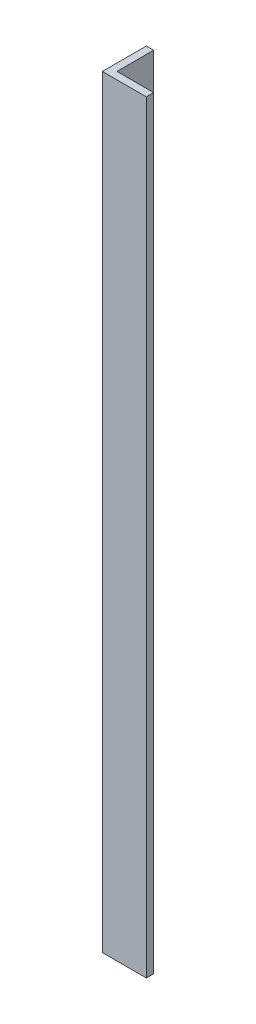
ISO-10303-21;
HEADER;
FILE_DESCRIPTION(('STEP AP214'),'2;1');
FILE_NAME('part.step','',(''),(''),'','','');
FILE_SCHEMA(('AUTOMOTIVE_DESIGN { 1 0 10303 214 1 1 1 1 }'));
ENDSEC;
DATA;
#1=APPLICATION_CONTEXT('core data for automotive mechanical design processes');
#2=APPLICATION_PROTOCOL_DEFINITION('international standard','automotive_design',2000,#1);
#3=PRODUCT_CONTEXT('',#1,'mechanical');
#4=PRODUCT('Part','Part','',(#3));
#5=PRODUCT_RELATED_PRODUCT_CATEGORY('part','',(#4));
#6=PRODUCT_DEFINITION_FORMATION('','',#4);
#7=PRODUCT_DEFINITION_CONTEXT('part definition',#1,'design');
#8=PRODUCT_DEFINITION('design','',#6,#7);
#9=PRODUCT_DEFINITION_SHAPE('','',#8);
#10=(LENGTH_UNIT() NAMED_UNIT(*) SI_UNIT(.MILLI.,.METRE.));
#11=(NAMED_UNIT(*) PLANE_ANGLE_UNIT() SI_UNIT($,.RADIAN.));
#12=(NAMED_UNIT(*) SI_UNIT($,.STERADIAN.) SOLID_ANGLE_UNIT());
#13=UNCERTAINTY_MEASURE_WITH_UNIT(LENGTH_MEASURE(1.E-05),#10,'distance_accuracy_value','');
#14=(GEOMETRIC_REPRESENTATION_CONTEXT(3) GLOBAL_UNCERTAINTY_ASSIGNED_CONTEXT((#13)) GLOBAL_UNIT_ASSIGNED_CONTEXT((#10,
#11,#12)) REPRESENTATION_CONTEXT('',''));
#15=CARTESIAN_POINT('',(0.,0.,0.));
#16=DIRECTION('',(0.,0.,1.));
#17=DIRECTION('',(1.,0.,0.));
#18=AXIS2_PLACEMENT_3D('',#15,#16,#17);
#19=CARTESIAN_POINT('',(0.,330.2,0.));
#20=DIRECTION('',(1.,0.,0.));
#21=DIRECTION('',(0.,0.,-1.));
#22=AXIS2_PLACEMENT_3D('',#19,#20,#21);
#23=PLANE('',#22);
#24=CARTESIAN_POINT('',(0.,53.9749999999999,-12.6999999999999));
#25=DIRECTION('',(1.,0.,0.));
#26=DIRECTION('',(0.,0.,-1.));
#27=AXIS2_PLACEMENT_3D('',#24,#25,#26);
#28=CIRCLE('',#27,2.413);
#29=CARTESIAN_POINT('',(0.,53.9749999999999,-15.1129999999999));
#30=VERTEX_POINT('',#29);
#31=EDGE_CURVE('E138',#30,#30,#28,.F.);
#32=ORIENTED_EDGE('',*,*,#31,.F.);
#33=EDGE_LOOP('',(#32));
#34=FACE_BOUND('',#33,.T.);
#35=CARTESIAN_POINT('',(0.,301.625,-12.6999999999999));
#36=DIRECTION('',(1.,0.,0.));
#37=DIRECTION('',(0.,0.,-1.));
#38=AXIS2_PLACEMENT_3D('',#35,#36,#37);
#39=CIRCLE('',#38,2.413);
#40=CARTESIAN_POINT('',(0.,301.625,-15.1129999999999));
#41=VERTEX_POINT('',#40);
#42=EDGE_CURVE('E186',#41,#41,#39,.F.);
#43=ORIENTED_EDGE('',*,*,#42,.F.);
#44=EDGE_LOOP('',(#43));
#45=FACE_BOUND('',#44,.T.);
#46=DIRECTION('',(0.,0.,1.));
#47=VECTOR('',#46,1.);
#48=CARTESIAN_POINT('',(0.,0.,0.));
#49=LINE('',#48,#47);
#50=CARTESIAN_POINT('',(0.,0.,-19.05));
#51=VERTEX_POINT('',#50);
#52=CARTESIAN_POINT('',(0.,0.,0.));
#53=VERTEX_POINT('',#52);
#54=EDGE_CURVE('E134',#51,#53,#49,.T.);
#55=ORIENTED_EDGE('',*,*,#54,.T.);
#56=DIRECTION('',(0.,-1.,0.));
#57=VECTOR('',#56,1.);
#58=CARTESIAN_POINT('',(0.,330.2,0.));
#59=LINE('',#58,#57);
#60=CARTESIAN_POINT('',(0.,330.2,0.));
#61=VERTEX_POINT('',#60);
#62=EDGE_CURVE('E11',#61,#53,#59,.T.);
#63=ORIENTED_EDGE('',*,*,#62,.F.);
#64=DIRECTION('',(0.,0.,1.));
#65=VECTOR('',#64,1.);
#66=CARTESIAN_POINT('',(0.,330.2,0.));
#67=LINE('',#66,#65);
#68=CARTESIAN_POINT('',(0.,330.2,-19.05));
#69=VERTEX_POINT('',#68);
#70=EDGE_CURVE('E145',#69,#61,#67,.T.);
#71=ORIENTED_EDGE('',*,*,#70,.F.);
#72=DIRECTION('',(0.,-1.,0.));
#73=VECTOR('',#72,1.);
#74=CARTESIAN_POINT('',(0.,330.2,-19.05));
#75=LINE('',#74,#73);
#76=EDGE_CURVE('E130',#69,#51,#75,.T.);
#77=ORIENTED_EDGE('',*,*,#76,.T.);
#78=EDGE_LOOP('',(#55,#63,#71,#77));
#79=FACE_BOUND('',#78,.T.);
#80=ADVANCED_FACE('F39',(#34,#45,#79),#23,.F.);
#81=CARTESIAN_POINT('',(0.,330.2,0.));
#82=DIRECTION('',(0.,0.,-1.));
#83=DIRECTION('',(-1.,0.,0.));
#84=AXIS2_PLACEMENT_3D('',#81,#82,#83);
#85=PLANE('',#84);
#86=DIRECTION('',(1.,0.,0.));
#87=VECTOR('',#86,1.);
#88=CARTESIAN_POINT('',(0.,0.,0.));
#89=LINE('',#88,#87);
#90=CARTESIAN_POINT('',(19.05,0.,0.));
#91=VERTEX_POINT('',#90);
#92=EDGE_CURVE('E137',#53,#91,#89,.T.);
#93=ORIENTED_EDGE('',*,*,#92,.T.);
#94=DIRECTION('',(0.,-1.,0.));
#95=VECTOR('',#94,1.);
#96=CARTESIAN_POINT('',(19.05,330.2,0.));
#97=LINE('',#96,#95);
#98=CARTESIAN_POINT('',(19.05,330.2,0.));
#99=VERTEX_POINT('',#98);
#100=EDGE_CURVE('E48',#99,#91,#97,.T.);
#101=ORIENTED_EDGE('',*,*,#100,.F.);
#102=DIRECTION('',(1.,0.,0.));
#103=VECTOR('',#102,1.);
#104=CARTESIAN_POINT('',(0.,330.2,0.));
#105=LINE('',#104,#103);
#106=EDGE_CURVE('E98',#61,#99,#105,.T.);
#107=ORIENTED_EDGE('',*,*,#106,.F.);
#108=ORIENTED_EDGE('',*,*,#62,.T.);
#109=EDGE_LOOP('',(#93,#101,#107,#108));
#110=FACE_BOUND('',#109,.T.);
#111=ADVANCED_FACE('F176',(#110),#85,.F.);
#112=CARTESIAN_POINT('',(19.05,330.2,0.));
#113=DIRECTION('',(-1.,0.,0.));
#114=DIRECTION('',(0.,0.,1.));
#115=AXIS2_PLACEMENT_3D('',#112,#113,#114);
#116=PLANE('',#115);
#117=DIRECTION('',(0.,0.,-1.));
#118=VECTOR('',#117,1.);
#119=CARTESIAN_POINT('',(19.05,0.,0.));
#120=LINE('',#119,#118);
#121=CARTESIAN_POINT('',(19.05,0.,-3.175));
#122=VERTEX_POINT('',#121);
#123=EDGE_CURVE('E140',#91,#122,#120,.T.);
#124=ORIENTED_EDGE('',*,*,#123,.T.);
#125=DIRECTION('',(0.,-1.,0.));
#126=VECTOR('',#125,1.);
#127=CARTESIAN_POINT('',(19.05,330.2,-3.175));
#128=LINE('',#127,#126);
#129=CARTESIAN_POINT('',(19.05,330.2,-3.175));
#130=VERTEX_POINT('',#129);
#131=EDGE_CURVE('E123',#130,#122,#128,.T.);
#132=ORIENTED_EDGE('',*,*,#131,.F.);
#133=DIRECTION('',(0.,0.,-1.));
#134=VECTOR('',#133,1.);
#135=CARTESIAN_POINT('',(19.05,330.2,0.));
#136=LINE('',#135,#134);
#137=EDGE_CURVE('E112',#99,#130,#136,.T.);
#138=ORIENTED_EDGE('',*,*,#137,.F.);
#139=ORIENTED_EDGE('',*,*,#100,.T.);
#140=EDGE_LOOP('',(#124,#132,#138,#139));
#141=FACE_BOUND('',#140,.T.);
#142=ADVANCED_FACE('F157',(#141),#116,.F.);
#143=CARTESIAN_POINT('',(3.175,330.2,-3.175));
#144=DIRECTION('',(0.,0.,1.));
#145=DIRECTION('',(1.,0.,0.));
#146=AXIS2_PLACEMENT_3D('',#143,#144,#145);
#147=PLANE('',#146);
#148=DIRECTION('',(-1.,0.,0.));
#149=VECTOR('',#148,1.);
#150=CARTESIAN_POINT('',(3.175,0.,-3.175));
#151=LINE('',#150,#149);
#152=CARTESIAN_POINT('',(3.175,0.,-3.175));
#153=VERTEX_POINT('',#152);
#154=EDGE_CURVE('E121',#122,#153,#151,.T.);
#155=ORIENTED_EDGE('',*,*,#154,.T.);
#156=DIRECTION('',(0.,-1.,0.));
#157=VECTOR('',#156,1.);
#158=CARTESIAN_POINT('',(3.175,330.2,-3.175));
#159=LINE('',#158,#157);
#160=CARTESIAN_POINT('',(3.175,330.2,-3.175));
#161=VERTEX_POINT('',#160);
#162=EDGE_CURVE('E118',#161,#153,#159,.T.);
#163=ORIENTED_EDGE('',*,*,#162,.F.);
#164=DIRECTION('',(-1.,0.,0.));
#165=VECTOR('',#164,1.);
#166=CARTESIAN_POINT('',(3.175,330.2,-3.175));
#167=LINE('',#166,#165);
#168=EDGE_CURVE('E106',#130,#161,#167,.T.);
#169=ORIENTED_EDGE('',*,*,#168,.F.);
#170=ORIENTED_EDGE('',*,*,#131,.T.);
#171=EDGE_LOOP('',(#155,#163,#169,#170));
#172=FACE_BOUND('',#171,.T.);
#173=ADVANCED_FACE('F119',(#172),#147,.F.);
#174=CARTESIAN_POINT('',(3.175,330.2,-3.175));
#175=DIRECTION('',(-1.,0.,0.));
#176=DIRECTION('',(0.,0.,1.));
#177=AXIS2_PLACEMENT_3D('',#174,#175,#176);
#178=PLANE('',#177);
#179=CARTESIAN_POINT('',(3.175,53.9749999999999,-12.6999999999999));
#180=DIRECTION('',(1.,0.,0.));
#181=DIRECTION('',(0.,0.,-1.));
#182=AXIS2_PLACEMENT_3D('',#179,#180,#181);
#183=CIRCLE('',#182,2.413);
#184=CARTESIAN_POINT('',(3.175,53.9749999999999,-15.1129999999999));
#185=VERTEX_POINT('',#184);
#186=EDGE_CURVE('E189',#185,#185,#183,.T.);
#187=ORIENTED_EDGE('',*,*,#186,.F.);
#188=EDGE_LOOP('',(#187));
#189=FACE_BOUND('',#188,.T.);
#190=CARTESIAN_POINT('',(3.175,301.625,-12.6999999999999));
#191=DIRECTION('',(1.,0.,0.));
#192=DIRECTION('',(0.,0.,-1.));
#193=AXIS2_PLACEMENT_3D('',#190,#191,#192);
#194=CIRCLE('',#193,2.413);
#195=CARTESIAN_POINT('',(3.175,301.625,-15.1129999999999));
#196=VERTEX_POINT('',#195);
#197=EDGE_CURVE('E190',#196,#196,#194,.T.);
#198=ORIENTED_EDGE('',*,*,#197,.F.);
#199=EDGE_LOOP('',(#198));
#200=FACE_BOUND('',#199,.T.);
#201=DIRECTION('',(0.,0.,-1.));
#202=VECTOR('',#201,1.);
#203=CARTESIAN_POINT('',(3.175,0.,-3.175));
#204=LINE('',#203,#202);
#205=CARTESIAN_POINT('',(3.175,0.,-19.05));
#206=VERTEX_POINT('',#205);
#207=EDGE_CURVE('E82',#153,#206,#204,.T.);
#208=ORIENTED_EDGE('',*,*,#207,.T.);
#209=DIRECTION('',(0.,-1.,0.));
#210=VECTOR('',#209,1.);
#211=CARTESIAN_POINT('',(3.175,330.2,-19.05));
#212=LINE('',#211,#210);
#213=CARTESIAN_POINT('',(3.175,330.2,-19.05));
#214=VERTEX_POINT('',#213);
#215=EDGE_CURVE('E124',#214,#206,#212,.T.);
#216=ORIENTED_EDGE('',*,*,#215,.F.);
#217=DIRECTION('',(0.,0.,-1.));
#218=VECTOR('',#217,1.);
#219=CARTESIAN_POINT('',(3.175,330.2,-3.175));
#220=LINE('',#219,#218);
#221=EDGE_CURVE('E110',#161,#214,#220,.T.);
#222=ORIENTED_EDGE('',*,*,#221,.F.);
#223=ORIENTED_EDGE('',*,*,#162,.T.);
#224=EDGE_LOOP('',(#208,#216,#222,#223));
#225=FACE_BOUND('',#224,.T.);
#226=ADVANCED_FACE('F126',(#189,#200,#225),#178,.F.);
#227=CARTESIAN_POINT('',(0.,330.2,-19.05));
#228=DIRECTION('',(0.,0.,1.));
#229=DIRECTION('',(1.,0.,0.));
#230=AXIS2_PLACEMENT_3D('',#227,#228,#229);
#231=PLANE('',#230);
#232=DIRECTION('',(-1.,0.,0.));
#233=VECTOR('',#232,1.);
#234=CARTESIAN_POINT('',(0.,0.,-19.05));
#235=LINE('',#234,#233);
#236=EDGE_CURVE('E88',#206,#51,#235,.T.);
#237=ORIENTED_EDGE('',*,*,#236,.T.);
#238=ORIENTED_EDGE('',*,*,#76,.F.);
#239=DIRECTION('',(-1.,0.,0.));
#240=VECTOR('',#239,1.);
#241=CARTESIAN_POINT('',(0.,330.2,-19.05));
#242=LINE('',#241,#240);
#243=EDGE_CURVE('E59',#214,#69,#242,.T.);
#244=ORIENTED_EDGE('',*,*,#243,.F.);
#245=ORIENTED_EDGE('',*,*,#215,.T.);
#246=EDGE_LOOP('',(#237,#238,#244,#245));
#247=FACE_BOUND('',#246,.T.);
#248=ADVANCED_FACE('F164',(#247),#231,.F.);
#249=CARTESIAN_POINT('',(0.,330.2,0.));
#250=DIRECTION('',(0.,-1.,0.));
#251=DIRECTION('',(0.,0.,-1.));
#252=AXIS2_PLACEMENT_3D('',#249,#250,#251);
#253=PLANE('',#252);
#254=ORIENTED_EDGE('',*,*,#70,.T.);
#255=ORIENTED_EDGE('',*,*,#106,.T.);
#256=ORIENTED_EDGE('',*,*,#137,.T.);
#257=ORIENTED_EDGE('',*,*,#168,.T.);
#258=ORIENTED_EDGE('',*,*,#221,.T.);
#259=ORIENTED_EDGE('',*,*,#243,.T.);
#260=EDGE_LOOP('',(#254,#255,#256,#257,#258,#259));
#261=FACE_BOUND('',#260,.T.);
#262=ADVANCED_FACE('F108',(#261),#253,.F.);
#263=CARTESIAN_POINT('',(0.,0.,0.));
#264=DIRECTION('',(0.,-1.,0.));
#265=DIRECTION('',(0.,0.,-1.));
#266=AXIS2_PLACEMENT_3D('',#263,#264,#265);
#267=PLANE('',#266);
#268=ORIENTED_EDGE('',*,*,#54,.F.);
#269=ORIENTED_EDGE('',*,*,#236,.F.);
#270=ORIENTED_EDGE('',*,*,#207,.F.);
#271=ORIENTED_EDGE('',*,*,#154,.F.);
#272=ORIENTED_EDGE('',*,*,#123,.F.);
#273=ORIENTED_EDGE('',*,*,#92,.F.);
#274=EDGE_LOOP('',(#268,#269,#270,#271,#272,#273));
#275=FACE_BOUND('',#274,.T.);
#276=ADVANCED_FACE('F160',(#275),#267,.T.);
#277=CARTESIAN_POINT('',(-0.00100000000000013,301.625,-12.6999999999999));
#278=DIRECTION('',(1.,0.,0.));
#279=DIRECTION('',(0.,0.,-1.));
#280=AXIS2_PLACEMENT_3D('',#277,#278,#279);
#281=CYLINDRICAL_SURFACE('',#280,2.413);
#282=ORIENTED_EDGE('',*,*,#197,.T.);
#283=EDGE_LOOP('',(#282));
#284=FACE_BOUND('',#283,.T.);
#285=ORIENTED_EDGE('',*,*,#42,.T.);
#286=EDGE_LOOP('',(#285));
#287=FACE_BOUND('',#286,.T.);
#288=ADVANCED_FACE('F204',(#284,#287),#281,.F.);
#289=CARTESIAN_POINT('',(-0.00100000000000013,53.9749999999999,-12.6999999999999));
#290=DIRECTION('',(1.,0.,0.));
#291=DIRECTION('',(0.,0.,-1.));
#292=AXIS2_PLACEMENT_3D('',#289,#290,#291);
#293=CYLINDRICAL_SURFACE('',#292,2.413);
#294=ORIENTED_EDGE('',*,*,#186,.T.);
#295=EDGE_LOOP('',(#294));
#296=FACE_BOUND('',#295,.T.);
#297=ORIENTED_EDGE('',*,*,#31,.T.);
#298=EDGE_LOOP('',(#297));
#299=FACE_BOUND('',#298,.T.);
#300=ADVANCED_FACE('F202',(#296,#299),#293,.F.);
#301=CLOSED_SHELL('',(#80,#111,#142,#173,#226,#248,#262,#276,#288,#300));
#302=MANIFOLD_SOLID_BREP('B2',#301);
#303=ADVANCED_BREP_SHAPE_REPRESENTATION('',(#18,#302),#14);
#304=SHAPE_DEFINITION_REPRESENTATION(#9,#303);
ENDSEC;
END-ISO-10303-21;
